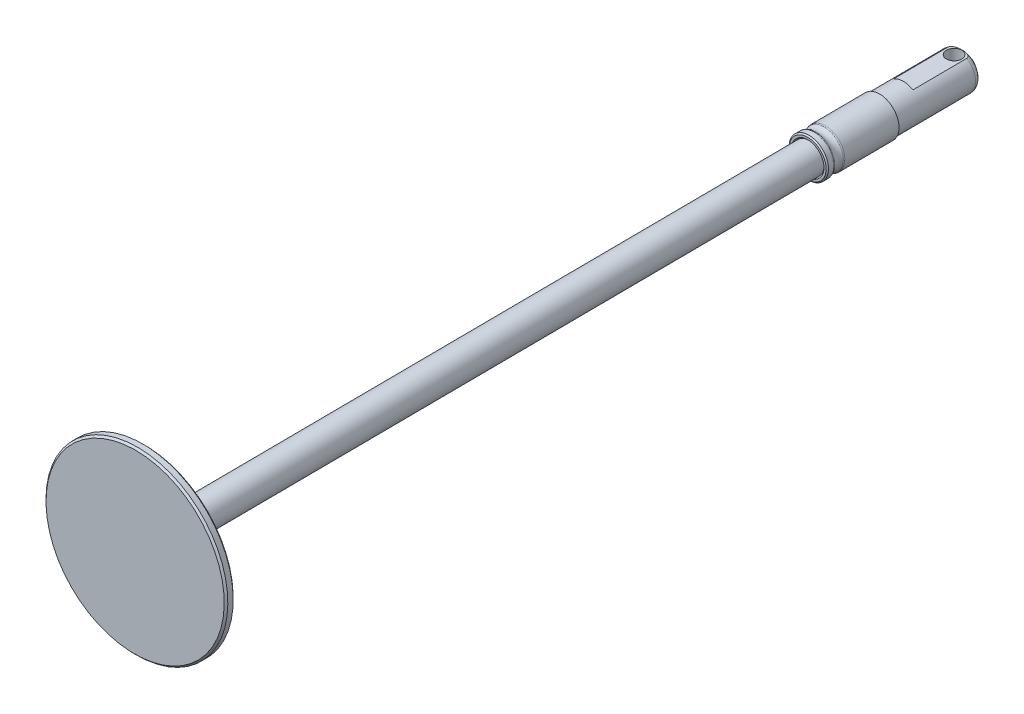
ISO-10303-21;
HEADER;
FILE_DESCRIPTION(('STEP AP214'),'2;1');
FILE_NAME('part.step','',(''),(''),'','','');
FILE_SCHEMA(('AUTOMOTIVE_DESIGN { 1 0 10303 214 1 1 1 1 }'));
ENDSEC;
DATA;
#1=APPLICATION_CONTEXT('core data for automotive mechanical design processes');
#2=APPLICATION_PROTOCOL_DEFINITION('international standard','automotive_design',2000,#1);
#3=PRODUCT_CONTEXT('',#1,'mechanical');
#4=PRODUCT('Part','Part','',(#3));
#5=PRODUCT_RELATED_PRODUCT_CATEGORY('part','',(#4));
#6=PRODUCT_DEFINITION_FORMATION('','',#4);
#7=PRODUCT_DEFINITION_CONTEXT('part definition',#1,'design');
#8=PRODUCT_DEFINITION('design','',#6,#7);
#9=PRODUCT_DEFINITION_SHAPE('','',#8);
#10=(LENGTH_UNIT() NAMED_UNIT(*) SI_UNIT(.MILLI.,.METRE.));
#11=(NAMED_UNIT(*) PLANE_ANGLE_UNIT() SI_UNIT($,.RADIAN.));
#12=(NAMED_UNIT(*) SI_UNIT($,.STERADIAN.) SOLID_ANGLE_UNIT());
#13=UNCERTAINTY_MEASURE_WITH_UNIT(LENGTH_MEASURE(1.E-05),#10,'distance_accuracy_value','');
#14=(GEOMETRIC_REPRESENTATION_CONTEXT(3) GLOBAL_UNCERTAINTY_ASSIGNED_CONTEXT((#13)) GLOBAL_UNIT_ASSIGNED_CONTEXT((#10,
#11,#12)) REPRESENTATION_CONTEXT('',''));
#15=CARTESIAN_POINT('',(0.,0.,0.));
#16=DIRECTION('',(0.,0.,1.));
#17=DIRECTION('',(1.,0.,0.));
#18=AXIS2_PLACEMENT_3D('',#15,#16,#17);
#19=CARTESIAN_POINT('',(6.47143842973408,0.,32.4994135550755));
#20=DIRECTION('',(0.00691899399214713,0.,0.99997606347459));
#21=DIRECTION('',(0.,-1.,0.));
#22=AXIS2_PLACEMENT_3D('',#19,#20,#21);
#23=CONICAL_SURFACE('',#22,2.70000000000437,0.785398163397448);
#24=CARTESIAN_POINT('',(6.47005463093599,0.,32.2994183424308));
#25=DIRECTION('',(0.00691899399214713,0.,0.99997606347459));
#26=DIRECTION('',(0.99997606347459,0.,-0.00691899399214713));
#27=AXIS2_PLACEMENT_3D('',#24,#25,#26);
#28=CIRCLE('',#27,2.50000000005457);
#29=CARTESIAN_POINT('',(8.96999478967704,0.,32.2821208574501));
#30=VERTEX_POINT('',#29);
#31=EDGE_CURVE('E282',#30,#30,#28,.T.);
#32=ORIENTED_EDGE('',*,*,#31,.F.);
#33=EDGE_LOOP('',(#32));
#34=FACE_BOUND('',#33,.T.);
#35=CARTESIAN_POINT('',(6.47143842973408,0.,32.4994135550755));
#36=DIRECTION('',(0.00691899399214713,0.,0.99997606347459));
#37=DIRECTION('',(0.,-1.,0.));
#38=AXIS2_PLACEMENT_3D('',#35,#36,#37);
#39=CIRCLE('',#38,2.70000000000437);
#40=CARTESIAN_POINT('',(6.47143842973408,-2.70000000000435,32.4994135550755));
#41=VERTEX_POINT('',#40);
#42=EDGE_CURVE('E285',#41,#41,#39,.F.);
#43=ORIENTED_EDGE('',*,*,#42,.F.);
#44=EDGE_LOOP('',(#43));
#45=FACE_BOUND('',#44,.T.);
#46=ADVANCED_FACE('F38',(#34,#45),#23,.F.);
#47=CARTESIAN_POINT('',(6.47143842973443,0.,32.4994135551274));
#48=DIRECTION('',(0.00691899399214713,0.,0.99997606347459));
#49=DIRECTION('',(0.99997606347459,0.,-0.00691899399214713));
#50=AXIS2_PLACEMENT_3D('',#47,#48,#49);
#51=PLANE('',#50);
#52=CARTESIAN_POINT('',(6.47143842973447,0.,32.4994135551324));
#53=DIRECTION('',(-0.00691899399214713,0.,-0.99997606347459));
#54=DIRECTION('',(0.,1.,0.));
#55=AXIS2_PLACEMENT_3D('',#52,#53,#54);
#56=CIRCLE('',#55,3.04999999997335);
#57=CARTESIAN_POINT('',(6.47143842973447,3.04999999997336,32.4994135551324));
#58=VERTEX_POINT('',#57);
#59=EDGE_CURVE('E291',#58,#58,#56,.T.);
#60=ORIENTED_EDGE('',*,*,#59,.F.);
#61=EDGE_LOOP('',(#60));
#62=FACE_BOUND('',#61,.T.);
#63=ORIENTED_EDGE('',*,*,#42,.T.);
#64=EDGE_LOOP('',(#63));
#65=FACE_BOUND('',#64,.T.);
#66=ADVANCED_FACE('F394',(#62,#65),#51,.T.);
#67=CARTESIAN_POINT('',(6.4700546309356,0.,32.299418342374));
#68=DIRECTION('',(-0.00691899399214713,0.,-0.99997606347459));
#69=DIRECTION('',(0.,1.,0.));
#70=AXIS2_PLACEMENT_3D('',#67,#68,#69);
#71=CONICAL_SURFACE('',#70,3.24999999997999,0.78539816325534);
#72=ORIENTED_EDGE('',*,*,#59,.T.);
#73=EDGE_LOOP('',(#72));
#74=FACE_BOUND('',#73,.T.);
#75=CARTESIAN_POINT('',(6.470054630936,0.,32.2994183424324));
#76=DIRECTION('',(-0.00691899399214713,0.,-0.99997606347459));
#77=DIRECTION('',(-0.99997606347459,0.,0.00691899399214713));
#78=AXIS2_PLACEMENT_3D('',#75,#76,#77);
#79=CIRCLE('',#78,3.25);
#80=CARTESIAN_POINT('',(3.22013242464359,0.,32.3219050729069));
#81=VERTEX_POINT('',#80);
#82=EDGE_CURVE('E287',#81,#81,#79,.T.);
#83=ORIENTED_EDGE('',*,*,#82,.F.);
#84=EDGE_LOOP('',(#83));
#85=FACE_BOUND('',#84,.T.);
#86=ADVANCED_FACE('F401',(#74,#85),#71,.T.);
#87=CARTESIAN_POINT('',(6.47143842973443,0.,32.4994135551274));
#88=DIRECTION('',(-0.00691899399214713,0.,-0.99997606347459));
#89=DIRECTION('',(-0.99997606347459,0.,0.00691899399214713));
#90=AXIS2_PLACEMENT_3D('',#87,#88,#89);
#91=CYLINDRICAL_SURFACE('',#90,3.25);
#92=ORIENTED_EDGE('',*,*,#82,.T.);
#93=EDGE_LOOP('',(#92));
#94=FACE_BOUND('',#93,.T.);
#95=CARTESIAN_POINT('',(6.46400751984752,0.,31.4254522215181));
#96=DIRECTION('',(-0.00691899399214887,0.,-0.99997606347459));
#97=DIRECTION('',(-0.99997606347459,0.,0.00691899399214899));
#98=AXIS2_PLACEMENT_3D('',#95,#96,#97);
#99=CIRCLE('',#98,3.25000000000171);
#100=CARTESIAN_POINT('',(3.21408531355339,0.,31.4479389519926));
#101=VERTEX_POINT('',#100);
#102=EDGE_CURVE('E290',#101,#101,#99,.T.);
#103=ORIENTED_EDGE('',*,*,#102,.F.);
#104=EDGE_LOOP('',(#103));
#105=FACE_BOUND('',#104,.T.);
#106=ADVANCED_FACE('F408',(#94,#105),#91,.T.);
#107=CARTESIAN_POINT('',(6.46400751984752,0.,31.4254522215181));
#108=DIRECTION('',(-0.00691899399214887,0.,-0.99997606347459));
#109=DIRECTION('',(-0.99997606347459,0.,0.00691899399214887));
#110=AXIS2_PLACEMENT_3D('',#107,#108,#109);
#111=TOROIDAL_SURFACE('',#110,2.95000000000171,0.3);
#112=ORIENTED_EDGE('',*,*,#102,.T.);
#113=EDGE_LOOP('',(#112));
#114=FACE_BOUND('',#113,.T.);
#115=CARTESIAN_POINT('',(6.46263457453887,0.,31.2270256229448));
#116=DIRECTION('',(0.00691899399215062,0.,0.99997606347459));
#117=DIRECTION('',(0.99997606347459,0.,-0.00691899399215068));
#118=AXIS2_PLACEMENT_3D('',#115,#116,#117);
#119=CIRCLE('',#118,3.17500000000299);
#120=CARTESIAN_POINT('',(9.63755857607368,0.,31.2050578170197));
#121=VERTEX_POINT('',#120);
#122=EDGE_CURVE('E118',#121,#121,#119,.T.);
#123=ORIENTED_EDGE('',*,*,#122,.T.);
#124=EDGE_LOOP('',(#123));
#125=FACE_BOUND('',#124,.T.);
#126=ADVANCED_FACE('F140',(#114,#125),#111,.T.);
#127=CARTESIAN_POINT('',(6.28462559194646,0.,5.50005984131344));
#128=DIRECTION('',(-0.00691899399214713,0.,-0.99997606347459));
#129=DIRECTION('',(-0.99997606347459,0.,0.00691899399214713));
#130=AXIS2_PLACEMENT_3D('',#127,#128,#129);
#131=PLANE('',#130);
#132=CARTESIAN_POINT('',(6.28462559194637,0.,5.50005984131344));
#133=DIRECTION('',(0.00691899399214713,0.,0.99997606347459));
#134=DIRECTION('',(0.99997606347459,0.,-0.00691899399214747));
#135=AXIS2_PLACEMENT_3D('',#132,#133,#134);
#136=CIRCLE('',#135,0.716666666666764);
#137=CARTESIAN_POINT('',(7.00127510410326,0.,5.4951012289524));
#138=VERTEX_POINT('',#137);
#139=CARTESIAN_POINT('',(5.56797607978949,0.,5.50501845367448));
#140=VERTEX_POINT('',#139);
#141=EDGE_CURVE('E114',#138,#140,#136,.T.);
#142=ORIENTED_EDGE('',*,*,#141,.F.);
#143=CARTESIAN_POINT('',(6.28462559194637,0.,5.50005984131344));
#144=DIRECTION('',(0.00691899399214713,0.,0.99997606347459));
#145=DIRECTION('',(-0.99997606347459,0.,0.00691899399214747));
#146=AXIS2_PLACEMENT_3D('',#143,#144,#145);
#147=CIRCLE('',#146,0.716666666666764);
#148=EDGE_CURVE('E110',#140,#138,#147,.T.);
#149=ORIENTED_EDGE('',*,*,#148,.F.);
#150=EDGE_LOOP('',(#142,#149));
#151=FACE_BOUND('',#150,.T.);
#152=ADVANCED_FACE('F121',(#151),#131,.T.);
#153=CARTESIAN_POINT('',(6.45760044174673,0.,30.4994614281782));
#154=DIRECTION('',(0.00691899399215062,0.,0.99997606347459));
#155=DIRECTION('',(0.99997606347459,0.,-0.00691899399215062));
#156=AXIS2_PLACEMENT_3D('',#153,#154,#155);
#157=TOROIDAL_SURFACE('',#156,4.00000000000341,1.1);
#158=ORIENTED_EDGE('',*,*,#122,.F.);
#159=EDGE_LOOP('',(#158));
#160=FACE_BOUND('',#159,.T.);
#161=CARTESIAN_POINT('',(6.45256630895634,0.,29.7718972334184));
#162=DIRECTION('',(0.00691899399214887,0.,0.99997606347459));
#163=DIRECTION('',(0.99997606347459,0.,-0.00691899399214876));
#164=AXIS2_PLACEMENT_3D('',#161,#162,#163);
#165=CIRCLE('',#164,3.17499999999869);
#166=CARTESIAN_POINT('',(9.62749031048685,0.,29.7499294274934));
#167=VERTEX_POINT('',#166);
#168=EDGE_CURVE('E122',#167,#167,#165,.F.);
#169=ORIENTED_EDGE('',*,*,#168,.F.);
#170=EDGE_LOOP('',(#169));
#171=FACE_BOUND('',#170,.T.);
#172=ADVANCED_FACE('F139',(#160,#171),#157,.F.);
#173=CARTESIAN_POINT('',(5.57489507378163,0.,6.50499451714907));
#174=DIRECTION('',(0.,1.,0.));
#175=DIRECTION('',(-0.99997606347459,0.,0.00691899399214713));
#176=AXIS2_PLACEMENT_3D('',#173,#174,#175);
#177=CIRCLE('',#176,1.);
#178=TRIMMED_CURVE('',#177,(PARAMETER_VALUE(-2.36980728294869)),
(PARAMETER_VALUE(2.36980728294869)),.T.,.PARAMETER.);
#179=CARTESIAN_POINT('',(6.29154458593852,0.,6.50003590478803));
#180=DIRECTION('',(-0.00691899399214713,0.,-0.99997606347459));
#181=AXIS1_PLACEMENT('',#179,#180);
#182=SURFACE_OF_REVOLUTION('',#178,#181);
#183=ORIENTED_EDGE('',*,*,#148,.T.);
#184=ORIENTED_EDGE('',*,*,#141,.T.);
#185=EDGE_LOOP('',(#183,#184));
#186=FACE_BOUND('',#185,.T.);
#187=CARTESIAN_POINT('',(6.28600939074497,0.,5.70005505403319));
#188=DIRECTION('',(0.00691899399215062,0.,0.99997606347459));
#189=DIRECTION('',(0.99997606347459,0.,-0.00691899399214976));
#190=AXIS2_PLACEMENT_3D('',#187,#188,#189);
#191=CIRCLE('',#190,1.31666666663942);
#192=CARTESIAN_POINT('',(7.60264454095926,0.,5.69094504527704));
#193=VERTEX_POINT('',#192);
#194=EDGE_CURVE('E170',#193,#193,#191,.T.);
#195=ORIENTED_EDGE('',*,*,#194,.F.);
#196=EDGE_LOOP('',(#195));
#197=FACE_BOUND('',#196,.T.);
#198=ADVANCED_FACE('F112',(#186,#197),#182,.F.);
#199=CARTESIAN_POINT('',(6.45119336364939,0.,29.573470634846));
#200=DIRECTION('',(0.00691899399214887,0.,0.99997606347459));
#201=DIRECTION('',(0.99997606347459,0.,-0.00691899399214887));
#202=AXIS2_PLACEMENT_3D('',#199,#200,#201);
#203=TOROIDAL_SURFACE('',#202,2.9499999999983,0.3);
#204=CARTESIAN_POINT('',(6.4511933636511,0.,29.573470634846));
#205=DIRECTION('',(-0.00691899399214713,0.,-0.99997606347459));
#206=DIRECTION('',(-0.99997606347459,0.,0.00691899399214713));
#207=AXIS2_PLACEMENT_3D('',#204,#205,#206);
#208=CIRCLE('',#207,3.25);
#209=CARTESIAN_POINT('',(3.20127115735869,0.,29.5959573653205));
#210=VERTEX_POINT('',#209);
#211=EDGE_CURVE('E176',#210,#210,#208,.T.);
#212=ORIENTED_EDGE('',*,*,#211,.F.);
#213=EDGE_LOOP('',(#212));
#214=FACE_BOUND('',#213,.T.);
#215=ORIENTED_EDGE('',*,*,#168,.T.);
#216=EDGE_LOOP('',(#215));
#217=FACE_BOUND('',#216,.T.);
#218=ADVANCED_FACE('F164',(#214,#217),#203,.T.);
#219=CARTESIAN_POINT('',(6.30192307692334,-3.24999999999998,7.99999999999993));
#220=DIRECTION('',(0.,1.,0.));
#221=DIRECTION('',(-0.99997606347459,0.,0.00691899399214713));
#222=AXIS2_PLACEMENT_3D('',#219,#220,#221);
#223=CYLINDRICAL_SURFACE('',#222,1.275);
#224=CARTESIAN_POINT('',(6.30192307692334,2.60000000000002,7.99999999999993));
#225=DIRECTION('',(0.,1.,0.));
#226=DIRECTION('',(-0.99997606347459,0.,0.00691899399214713));
#227=AXIS2_PLACEMENT_3D('',#224,#225,#226);
#228=CIRCLE('',#227,1.275);
#229=CARTESIAN_POINT('',(5.02695359599324,2.60000000000002,8.00882171733992));
#230=VERTEX_POINT('',#229);
#231=EDGE_CURVE('E173',#230,#230,#228,.T.);
#232=ORIENTED_EDGE('',*,*,#231,.T.);
#233=EDGE_LOOP('',(#232));
#234=FACE_BOUND('',#233,.T.);
#235=CARTESIAN_POINT('',(6.30192307692334,-2.59999999999998,7.99999999999993));
#236=DIRECTION('',(0.,1.,0.));
#237=DIRECTION('',(-0.99997606347459,0.,0.00691899399214713));
#238=AXIS2_PLACEMENT_3D('',#235,#236,#237);
#239=CIRCLE('',#238,1.275);
#240=CARTESIAN_POINT('',(5.02695359599324,-2.59999999999998,8.00882171733992));
#241=VERTEX_POINT('',#240);
#242=EDGE_CURVE('E195',#241,#241,#239,.F.);
#243=ORIENTED_EDGE('',*,*,#242,.T.);
#244=EDGE_LOOP('',(#243));
#245=FACE_BOUND('',#244,.T.);
#246=ADVANCED_FACE('F306',(#234,#245),#223,.F.);
#247=CARTESIAN_POINT('',(6.29292838473695,0.,6.70003111748414));
#248=DIRECTION('',(0.00691899399215105,0.,0.99997606347459));
#249=DIRECTION('',(0.99997606347459,0.,-0.00691899399215105));
#250=AXIS2_PLACEMENT_3D('',#247,#248,#249);
#251=CONICAL_SURFACE('',#250,2.64999999996017,0.92729521800843);
#252=CARTESIAN_POINT('',(6.29292838473695,0.,6.70003111748294));
#253=DIRECTION('',(-0.00691899399215062,0.,-0.99997606347459));
#254=DIRECTION('',(-0.99997606347459,0.,0.00691899399215105));
#255=AXIS2_PLACEMENT_3D('',#252,#253,#254);
#256=CIRCLE('',#255,2.65000000000009);
#257=CARTESIAN_POINT('',(5.78059311022955,2.60000000000002,6.7035760470267));
#258=VERTEX_POINT('',#257);
#259=CARTESIAN_POINT('',(5.78059311026074,-2.59999999999998,6.70357604703755));
#260=VERTEX_POINT('',#259);
#261=EDGE_CURVE('E179',#258,#260,#256,.F.);
#262=ORIENTED_EDGE('',*,*,#261,.F.);
#263=CARTESIAN_POINT('',(5.78059311023422,2.60000000000002,6.70357604705716));
#264=CARTESIAN_POINT('',(5.86552023323553,2.60000000000002,6.69061135992893));
#265=CARTESIAN_POINT('',(5.95092196332494,2.60000000000002,6.68062820190784));
#266=CARTESIAN_POINT('',(6.12176650438817,2.60000000000002,6.66690060894354));
#267=CARTESIAN_POINT('',(6.20720669140374,2.60000000000002,6.66312334195217));
#268=CARTESIAN_POINT('',(6.37813115349206,2.60000000000002,6.66194068831653));
#269=CARTESIAN_POINT('',(6.46361542856481,2.60000000000002,6.66453530167226));
#270=CARTESIAN_POINT('',(6.63463356984458,2.60000000000002,6.67589749217037));
#271=CARTESIAN_POINT('',(6.72016526666318,2.60000000000002,6.68469793452684));
#272=CARTESIAN_POINT('',(6.80526365921131,2.60000000000002,6.69648618797409));
#273=B_SPLINE_CURVE_WITH_KNOTS('',3,(#263,#264,#265,#266,#267,#268,#269,#270,#271,#272),
.UNSPECIFIED.,.F.,.F.,(4,2,2,2,4),(0.,0.257710646406221,0.514053441173921,0.770396235941627,
1.02810688234785),.UNSPECIFIED.);
#274=CARTESIAN_POINT('',(6.80526365921342,2.60000000000002,6.69648618795882));
#275=VERTEX_POINT('',#274);
#276=EDGE_CURVE('E180',#258,#275,#273,.T.);
#277=ORIENTED_EDGE('',*,*,#276,.T.);
#278=CARTESIAN_POINT('',(6.29292838473695,0.,6.70003111748294));
#279=DIRECTION('',(-0.00691899399215062,0.,-0.99997606347459));
#280=DIRECTION('',(-0.99997606347459,0.,0.00691899399215105));
#281=AXIS2_PLACEMENT_3D('',#278,#279,#280);
#282=CIRCLE('',#281,2.65000000000009);
#283=CARTESIAN_POINT('',(6.80526365921337,-2.59999999999998,6.69648618795881));
#284=VERTEX_POINT('',#283);
#285=EDGE_CURVE('E243',#284,#275,#282,.F.);
#286=ORIENTED_EDGE('',*,*,#285,.F.);
#287=CARTESIAN_POINT('',(6.80526365921122,-2.59999999999998,6.69648618797408));
#288=CARTESIAN_POINT('',(6.72016526666553,-2.59999999999998,6.68469793452717));
#289=CARTESIAN_POINT('',(6.63463356984939,-2.59999999999998,6.67589749217087));
#290=CARTESIAN_POINT('',(6.46361542857452,-2.59999999999998,6.66453530167273));
#291=CARTESIAN_POINT('',(6.3781311535042,-2.59999999999998,6.6619406883168));
#292=CARTESIAN_POINT('',(6.20720669142073,-2.59999999999998,6.66312334195169));
#293=CARTESIAN_POINT('',(6.12176650440756,-2.59999999999998,6.6669006089425));
#294=CARTESIAN_POINT('',(5.95092196334911,-2.59999999999998,6.68062820190536));
#295=CARTESIAN_POINT('',(5.86552023326208,-2.59999999999998,6.69061135992556));
#296=CARTESIAN_POINT('',(5.7805931102631,-2.59999999999998,6.70357604705277));
#297=B_SPLINE_CURVE_WITH_KNOTS('',3,(#287,#288,#289,#290,#291,#292,#293,#294,#295,#296),
.UNSPECIFIED.,.F.,.F.,(4,2,2,2,4),(0.,0.257710646398846,0.514053441159284,0.770396235919723,
1.02810688231857),.UNSPECIFIED.);
#298=EDGE_CURVE('E273',#284,#260,#297,.T.);
#299=ORIENTED_EDGE('',*,*,#298,.T.);
#300=EDGE_LOOP('',(#262,#277,#286,#299));
#301=FACE_BOUND('',#300,.T.);
#302=ORIENTED_EDGE('',*,*,#194,.T.);
#303=EDGE_LOOP('',(#302));
#304=FACE_BOUND('',#303,.T.);
#305=ADVANCED_FACE('F311',(#301,#304),#251,.T.);
#306=CARTESIAN_POINT('',(-10.1388705214707,3.25000000000002,16.6139599404043));
#307=DIRECTION('',(0.00691899399214713,0.,0.99997606347459));
#308=DIRECTION('',(0.99997606347459,0.,-0.00691899399214713));
#309=AXIS2_PLACEMENT_3D('',#306,#307,#308);
#310=PLANE('',#309);
#311=CARTESIAN_POINT('',(6.36073452586002,0.,16.499796539534));
#312=DIRECTION('',(0.00691899399215062,0.,0.99997606347459));
#313=DIRECTION('',(0.99997606347459,0.,-0.00691899399215062));
#314=AXIS2_PLACEMENT_3D('',#311,#312,#313);
#315=CIRCLE('',#314,3.05000000000008);
#316=CARTESIAN_POINT('',(7.95521823045706,2.60000000000002,16.4887640522819));
#317=VERTEX_POINT('',#316);
#318=CARTESIAN_POINT('',(4.76625082126298,2.60000000000002,16.5108290267861));
#319=VERTEX_POINT('',#318);
#320=EDGE_CURVE('E183',#317,#319,#315,.T.);
#321=ORIENTED_EDGE('',*,*,#320,.F.);
#322=DIRECTION('',(0.99997606347459,0.,-0.00691899399214713));
#323=VECTOR('',#322,1.);
#324=CARTESIAN_POINT('',(-10.1388705214707,2.60000000000002,16.6139599404045));
#325=LINE('',#324,#323);
#326=EDGE_CURVE('E98',#317,#319,#325,.F.);
#327=ORIENTED_EDGE('',*,*,#326,.T.);
#328=EDGE_LOOP('',(#321,#327));
#329=FACE_BOUND('',#328,.T.);
#330=ADVANCED_FACE('F234',(#329),#310,.F.);
#331=CARTESIAN_POINT('',(-10.1388705214707,2.60000000000002,16.6139599404043));
#332=DIRECTION('',(0.,-1.,0.));
#333=DIRECTION('',(-0.00691899399214713,0.,-0.99997606347459));
#334=AXIS2_PLACEMENT_3D('',#331,#332,#333);
#335=PLANE('',#334);
#336=CARTESIAN_POINT('',(4.70397987533363,2.60000000000002,7.5110444555147));
#337=CARTESIAN_POINT('',(4.70384987644721,2.60000000000002,7.49290841887377));
#338=CARTESIAN_POINT('',(4.70467367993067,2.60000000000002,7.4747792306576));
#339=CARTESIAN_POINT('',(4.70817762205473,2.60000000000002,7.43872032171689));
#340=CARTESIAN_POINT('',(4.71085575720852,2.60000000000002,7.42079040691319));
#341=CARTESIAN_POINT('',(4.72151035677255,2.60000000000002,7.36795172331959));
#342=CARTESIAN_POINT('',(4.73210683583856,2.60000000000002,7.33354430287102));
#343=CARTESIAN_POINT('',(4.75931961074297,2.60000000000002,7.26743057494155));
#344=CARTESIAN_POINT('',(4.77591271055891,2.60000000000002,7.23571443303589));
#345=CARTESIAN_POINT('',(4.81399534252052,2.60000000000002,7.17529865328853));
#346=CARTESIAN_POINT('',(4.83549871942386,2.60000000000002,7.14660788654726));
#347=CARTESIAN_POINT('',(4.89191934875167,2.60000000000002,7.08134381848383));
#348=CARTESIAN_POINT('',(4.92871113766357,2.60000000000002,7.04639998413353));
#349=CARTESIAN_POINT('',(5.00728682887246,2.60000000000002,6.98272702596022));
#350=CARTESIAN_POINT('',(5.04908010401538,2.60000000000001,6.95400986324759));
#351=CARTESIAN_POINT('',(5.16383022771077,2.60000000000001,6.88534773186314));
#352=CARTESIAN_POINT('',(5.23954402733486,2.60000000000002,6.850058458898));
#353=CARTESIAN_POINT('',(5.3952448432293,2.60000000000002,6.79081299539318));
#354=CARTESIAN_POINT('',(5.47524336906396,2.60000000000002,6.76688922834342));
#355=CARTESIAN_POINT('',(5.59338878295469,2.60000000000002,6.73829565222909));
#356=CARTESIAN_POINT('',(5.63075729257948,2.60000000000002,6.73021238396721));
#357=CARTESIAN_POINT('',(5.70558026739417,2.60000000000002,6.71571581567108));
#358=CARTESIAN_POINT('',(5.74303279523037,2.60000000000002,6.70929256443689));
#359=CARTESIAN_POINT('',(5.78059311022959,2.60000000000002,6.7035760470267));
#360=B_SPLINE_CURVE_WITH_KNOTS('',3,(#336,#337,#338,#339,#340,#341,#342,#343,#344,#345,#346,
#347,#348,#349,#350,#351,#352,#353,#354,#355,#356,#357,#358,#359),.UNSPECIFIED.,.F.,.F.,(4,2,2,
2,2,2,2,2,2,2,2,4),(0.,0.0543595006208801,0.108660360737125,0.215938070539347,0.322805175998552,
0.429977402492625,0.581352056766434,0.733014967075773,0.982209476205452,1.23211068022507,
1.34678143385737,1.46074793888463),.UNSPECIFIED.);
#361=CARTESIAN_POINT('',(4.70397987533363,2.60000000000002,7.5110444555147));
#362=VERTEX_POINT('',#361);
#363=EDGE_CURVE('E186',#362,#258,#360,.T.);
#364=ORIENTED_EDGE('',*,*,#363,.F.);
#365=DIRECTION('',(0.00691899399215062,0.,0.99997606347459));
#366=VECTOR('',#365,1.);
#367=CARTESIAN_POINT('',(11.8028677112802,2.59999999999979,1033.48648558044));
#368=LINE('',#367,#366);
#369=EDGE_CURVE('E187',#319,#362,#368,.F.);
#370=ORIENTED_EDGE('',*,*,#369,.F.);
#371=ORIENTED_EDGE('',*,*,#326,.F.);
#372=DIRECTION('',(0.00691899399215062,0.,0.99997606347459));
#373=VECTOR('',#372,1.);
#374=CARTESIAN_POINT('',(14.9918351204742,2.59999999999979,1033.46442060594));
#375=LINE('',#374,#373);
#376=CARTESIAN_POINT('',(7.8929472845277,2.60000000000002,7.48897948101051));
#377=VERTEX_POINT('',#376);
#378=EDGE_CURVE('E181',#377,#317,#375,.T.);
#379=ORIENTED_EDGE('',*,*,#378,.F.);
#380=CARTESIAN_POINT('',(6.80526365921553,2.60000000000002,6.69648618794356));
#381=CARTESIAN_POINT('',(6.8561154976496,2.60000000000002,6.70352634348705));
#382=CARTESIAN_POINT('',(6.9068293715514,2.60000000000002,6.71183531196478));
#383=CARTESIAN_POINT('',(7.00787456033053,2.60000000000002,6.73156842313693));
#384=CARTESIAN_POINT('',(7.05820318585411,2.60000000000002,6.74300620065973));
#385=CARTESIAN_POINT('',(7.15863558469799,2.60000000000002,6.76971330964486));
#386=CARTESIAN_POINT('',(7.20872559122189,2.60000000000002,6.78503563745771));
#387=CARTESIAN_POINT('',(7.30724687635603,2.60000000000002,6.82012973000199));
#388=CARTESIAN_POINT('',(7.35568118605749,2.60000000000002,6.83989279999233));
#389=CARTESIAN_POINT('',(7.4458536808667,2.60000000000002,6.8827245761694));
#390=CARTESIAN_POINT('',(7.48780361177337,2.60000000000003,6.9053405613773));
#391=CARTESIAN_POINT('',(7.56852650767192,2.60000000000001,6.95562734933633));
#392=CARTESIAN_POINT('',(7.60730455729318,2.59999999999997,6.98328982290031));
#393=CARTESIAN_POINT('',(7.6807406333427,2.60000000000003,7.04473791282664));
#394=CARTESIAN_POINT('',(7.71532996694611,2.60000000000013,7.07860730821165));
#395=CARTESIAN_POINT('',(7.7773368040371,2.59999999999991,7.15241010268089));
#396=CARTESIAN_POINT('',(7.80477485927188,2.5999999999996,7.19232559149439));
#397=CARTESIAN_POINT('',(7.84177699491922,2.59999999999973,7.2624224590737));
#398=CARTESIAN_POINT('',(7.85423315948979,2.59999999999994,7.2910862113278));
#399=CARTESIAN_POINT('',(7.87421840865154,2.60000000000009,7.3500668753495));
#400=CARTESIAN_POINT('',(7.88175801621602,2.60000000000003,7.38038010494399));
#401=CARTESIAN_POINT('',(7.88860703832785,2.60000000000001,7.42397173510465));
#402=CARTESIAN_POINT('',(7.89015347167473,2.60000000000002,7.43692704495919));
#403=CARTESIAN_POINT('',(7.89227839762122,2.60000000000002,7.46291142619274));
#404=CARTESIAN_POINT('',(7.89285728328814,2.60000000000003,7.47594046545958));
#405=CARTESIAN_POINT('',(7.8929472845277,2.60000000000002,7.48897948101051));
#406=B_SPLINE_CURVE_WITH_KNOTS('',3,(#380,#381,#382,#383,#384,#385,#386,#387,#388,#389,#390,
#391,#392,#393,#394,#395,#396,#397,#398,#399,#400,#401,#402,#403,#404,#405),.UNSPECIFIED.,.F.,
.F.,(4,2,2,2,2,2,2,2,2,2,2,2,4),(0.,0.154050765632774,0.308783858109109,0.465753667288842,
0.622418775181398,0.765095356129827,0.907538546731808,1.05206885101856,1.1961790981966,
1.28957553046733,1.38277140321643,1.42188324686408,1.46097919741619),.UNSPECIFIED.);
#407=EDGE_CURVE('E184',#275,#377,#406,.T.);
#408=ORIENTED_EDGE('',*,*,#407,.F.);
#409=ORIENTED_EDGE('',*,*,#276,.F.);
#410=EDGE_LOOP('',(#364,#370,#371,#379,#408,#409));
#411=FACE_BOUND('',#410,.T.);
#412=ORIENTED_EDGE('',*,*,#231,.F.);
#413=EDGE_LOOP('',(#412));
#414=FACE_BOUND('',#413,.T.);
#415=ADVANCED_FACE('F230',(#411,#414),#335,.F.);
#416=CARTESIAN_POINT('',(6.47143842973443,0.,32.4994135551274));
#417=DIRECTION('',(-0.00691899399214713,0.,-0.99997606347459));
#418=DIRECTION('',(-0.99997606347459,0.,0.00691899399214713));
#419=AXIS2_PLACEMENT_3D('',#416,#417,#418);
#420=CYLINDRICAL_SURFACE('',#419,3.25);
#421=ORIENTED_EDGE('',*,*,#211,.T.);
#422=EDGE_LOOP('',(#421));
#423=FACE_BOUND('',#422,.T.);
#424=CARTESIAN_POINT('',(6.38841050182867,0.,20.4997007934323));
#425=DIRECTION('',(-0.00691899399214713,0.,-0.99997606347459));
#426=DIRECTION('',(-0.99997606347459,0.,0.00691899399214713));
#427=AXIS2_PLACEMENT_3D('',#424,#425,#426);
#428=CIRCLE('',#427,3.25);
#429=CARTESIAN_POINT('',(3.13848829553625,0.,20.5221875239068));
#430=VERTEX_POINT('',#429);
#431=EDGE_CURVE('E190',#430,#430,#428,.F.);
#432=ORIENTED_EDGE('',*,*,#431,.T.);
#433=EDGE_LOOP('',(#432));
#434=FACE_BOUND('',#433,.T.);
#435=ADVANCED_FACE('F207',(#423,#434),#420,.T.);
#436=CARTESIAN_POINT('',(6.29846357993067,0.,7.5000119682626));
#437=DIRECTION('',(-0.00691899399215062,0.,-0.99997606347459));
#438=DIRECTION('',(-0.99997606347459,0.,0.00691899399215062));
#439=AXIS2_PLACEMENT_3D('',#436,#437,#438);
#440=TOROIDAL_SURFACE('',#439,2.05000000000008,1.);
#441=ORIENTED_EDGE('',*,*,#261,.T.);
#442=CARTESIAN_POINT('',(5.78059311025847,-2.59999999999998,6.7035760470223));
#443=CARTESIAN_POINT('',(5.7298435598873,-2.59999999999998,6.71131919879181));
#444=CARTESIAN_POINT('',(5.67924951823685,-2.59999999999998,6.72032913290729));
#445=CARTESIAN_POINT('',(5.57848706404387,-2.59999999999998,6.74145858337225));
#446=CARTESIAN_POINT('',(5.52832152927166,-2.59999999999998,6.75359169603028));
#447=CARTESIAN_POINT('',(5.4282683101303,-2.59999999999998,6.78168599700631));
#448=CARTESIAN_POINT('',(5.37839512458475,-2.59999999999998,6.7976999861005));
#449=CARTESIAN_POINT('',(5.2803688923733,-2.59999999999998,6.83415402228879));
#450=CARTESIAN_POINT('',(5.23221269459154,-2.59999999999998,6.85458541741749));
#451=CARTESIAN_POINT('',(5.14264152476062,-2.59999999999998,6.89866086869959));
#452=CARTESIAN_POINT('',(5.10100856258862,-2.59999999999999,6.92185517728559));
#453=CARTESIAN_POINT('',(5.02098924681104,-2.59999999999997,6.97325416626373));
#454=CARTESIAN_POINT('',(4.98259769380648,-2.59999999999994,7.00145058862553));
#455=CARTESIAN_POINT('',(4.91001894646721,-2.6,7.06390897842072));
#456=CARTESIAN_POINT('',(4.87590159768571,-2.60000000000009,7.09825376630762));
#457=CARTESIAN_POINT('',(4.81492195517371,-2.59999999999987,7.17290752385945));
#458=CARTESIAN_POINT('',(4.78803886382756,-2.59999999999957,7.21319886935649));
#459=CARTESIAN_POINT('',(4.75201024734093,-2.59999999999969,7.28380104836646));
#460=CARTESIAN_POINT('',(4.73995191455017,-2.59999999999991,7.31263442034063));
#461=CARTESIAN_POINT('',(4.72078473305888,-2.60000000000006,7.37188598627924));
#462=CARTESIAN_POINT('',(4.71366531143994,-2.6,7.40230064403642));
#463=CARTESIAN_POINT('',(4.70742015110281,-2.59999999999998,7.44598287493545));
#464=CARTESIAN_POINT('',(4.70605313694998,-2.59999999999998,7.45895834339827));
#465=CARTESIAN_POINT('',(4.70428797740283,-2.59999999999999,7.48496964075426));
#466=CARTESIAN_POINT('',(4.70388943853446,-2.59999999999999,7.49800544297747));
#467=CARTESIAN_POINT('',(4.70397987533363,-2.59999999999998,7.5110444555147));
#468=B_SPLINE_CURVE_WITH_KNOTS('',3,(#442,#443,#444,#445,#446,#447,#448,#449,#450,#451,#452,
#453,#454,#455,#456,#457,#458,#459,#460,#461,#462,#463,#464,#465,#466,#467),.UNSPECIFIED.,.F.,
.F.,(4,2,2,2,2,2,2,2,2,2,2,2,4),(0.,0.154050765632784,0.308783858109128,0.465753667288872,
0.622418775181439,0.765095356129876,0.907538546731866,1.05206885101862,1.19617909819667,
1.28957553046741,1.38277140321651,1.42188324686416,1.46097919741628),.UNSPECIFIED.);
#469=CARTESIAN_POINT('',(4.70397987533363,-2.59999999999998,7.51104445551469));
#470=VERTEX_POINT('',#469);
#471=EDGE_CURVE('E212',#260,#470,#468,.T.);
#472=ORIENTED_EDGE('',*,*,#471,.T.);
#473=CARTESIAN_POINT('',(6.29846357993067,0.,7.5000119682626));
#474=DIRECTION('',(0.00691899399215062,0.,0.99997606347459));
#475=DIRECTION('',(0.99997606347459,0.,-0.00691899399215062));
#476=AXIS2_PLACEMENT_3D('',#473,#474,#475);
#477=CIRCLE('',#476,3.05000000000008);
#478=EDGE_CURVE('E84',#362,#470,#477,.T.);
#479=ORIENTED_EDGE('',*,*,#478,.F.);
#480=ORIENTED_EDGE('',*,*,#363,.T.);
#481=EDGE_LOOP('',(#441,#472,#479,#480));
#482=FACE_BOUND('',#481,.T.);
#483=ADVANCED_FACE('F201',(#482),#440,.T.);
#484=CARTESIAN_POINT('',(-10.1388705214707,-3.24999999999998,16.6139599404043));
#485=DIRECTION('',(0.00691899399214713,0.,0.99997606347459));
#486=DIRECTION('',(0.99997606347459,0.,-0.00691899399214713));
#487=AXIS2_PLACEMENT_3D('',#484,#485,#486);
#488=PLANE('',#487);
#489=CARTESIAN_POINT('',(6.36073452586002,0.,16.499796539534));
#490=DIRECTION('',(0.00691899399215062,0.,0.99997606347459));
#491=DIRECTION('',(0.99997606347459,0.,-0.00691899399215062));
#492=AXIS2_PLACEMENT_3D('',#489,#490,#491);
#493=CIRCLE('',#492,3.05000000000008);
#494=CARTESIAN_POINT('',(4.76625082126298,-2.59999999999998,16.5108290267861));
#495=VERTEX_POINT('',#494);
#496=CARTESIAN_POINT('',(7.95521823045705,-2.59999999999999,16.4887640522819));
#497=VERTEX_POINT('',#496);
#498=EDGE_CURVE('E270',#495,#497,#493,.T.);
#499=ORIENTED_EDGE('',*,*,#498,.F.);
#500=DIRECTION('',(0.99997606347459,0.,-0.00691899399214713));
#501=VECTOR('',#500,1.);
#502=CARTESIAN_POINT('',(-10.1388705214707,-2.59999999999998,16.6139599404045));
#503=LINE('',#502,#501);
#504=EDGE_CURVE('E271',#495,#497,#503,.T.);
#505=ORIENTED_EDGE('',*,*,#504,.T.);
#506=EDGE_LOOP('',(#499,#505));
#507=FACE_BOUND('',#506,.T.);
#508=ADVANCED_FACE('F206',(#507),#488,.F.);
#509=CARTESIAN_POINT('',(-10.1388705214707,-2.59999999999998,16.6139599404043));
#510=DIRECTION('',(0.,1.,0.));
#511=DIRECTION('',(0.00691899399214713,0.,0.99997606347459));
#512=AXIS2_PLACEMENT_3D('',#509,#510,#511);
#513=PLANE('',#512);
#514=ORIENTED_EDGE('',*,*,#471,.F.);
#515=ORIENTED_EDGE('',*,*,#298,.F.);
#516=CARTESIAN_POINT('',(7.8929472845277,-2.59999999999998,7.4889794810105));
#517=CARTESIAN_POINT('',(7.89282631071752,-2.59999999999998,7.47084338192363));
#518=CARTESIAN_POINT('',(7.89175172062538,-2.59999999999998,7.45272732899561));
#519=CARTESIAN_POINT('',(7.88774914318137,-2.59999999999998,7.41672035886193));
#520=CARTESIAN_POINT('',(7.88482315643889,-2.59999999999998,7.39882921987212));
#521=CARTESIAN_POINT('',(7.87343841343228,-2.59999999999998,7.34614303000753));
#522=CARTESIAN_POINT('',(7.86236683085184,-2.59999999999998,7.31188553433599));
#523=CARTESIAN_POINT('',(7.83424180235975,-2.59999999999998,7.24615469750085));
#524=CARTESIAN_POINT('',(7.81721141416426,-2.59999999999998,7.21467120187547));
#525=CARTESIAN_POINT('',(7.77829641560007,-2.59999999999998,7.15478818102353));
#526=CARTESIAN_POINT('',(7.75639808455452,-2.59999999999998,7.12639771762703));
#527=CARTESIAN_POINT('',(7.69907975544533,-2.59999999999998,7.06192062757122));
#528=CARTESIAN_POINT('',(7.66180794837633,-2.59999999999998,7.02748925106301));
#529=CARTESIAN_POINT('',(7.582358695854,-2.59999999999998,6.96490969269818));
#530=CARTESIAN_POINT('',(7.54017204396588,-2.59999999999998,6.93677360050495));
#531=CARTESIAN_POINT('',(7.42448278401013,-2.59999999999998,6.86970591599706));
#532=CARTESIAN_POINT('',(7.34828791275416,-2.59999999999998,6.8354677233723));
#533=CARTESIAN_POINT('',(7.19178218603943,-2.59999999999998,6.77838246676796));
#534=CARTESIAN_POINT('',(7.11146027078345,-2.59999999999998,6.75556798243929));
#535=CARTESIAN_POINT('',(6.99293050062379,-2.59999999999998,6.72861199969867));
#536=CARTESIAN_POINT('',(6.95545371534884,-2.59999999999998,6.72104659797758));
#537=CARTESIAN_POINT('',(6.88043730591075,-2.59999999999998,6.70758679229599));
#538=CARTESIAN_POINT('',(6.84289948121453,-2.59999999999998,6.70168241127991));
#539=CARTESIAN_POINT('',(6.80526365921543,-2.59999999999998,6.69648618794355));
#540=B_SPLINE_CURVE_WITH_KNOTS('',3,(#516,#517,#518,#519,#520,#521,#522,#523,#524,#525,#526,
#527,#528,#529,#530,#531,#532,#533,#534,#535,#536,#537,#538,#539),.UNSPECIFIED.,.F.,.F.,(4,2,2,
2,2,2,2,2,2,2,2,4),(0.,0.0543595006208795,0.108660360737124,0.215938070539345,0.322805175998548,
0.42997740249262,0.58135205676643,0.733014967075762,0.982209476205401,1.23211068022505,
1.34678143387205,1.46074793891383),.UNSPECIFIED.);
#541=CARTESIAN_POINT('',(7.8929472845277,-2.59999999999999,7.48897948101051));
#542=VERTEX_POINT('',#541);
#543=EDGE_CURVE('E58',#542,#284,#540,.T.);
#544=ORIENTED_EDGE('',*,*,#543,.F.);
#545=DIRECTION('',(0.00691899399215062,0.,0.99997606347459));
#546=VECTOR('',#545,1.);
#547=CARTESIAN_POINT('',(14.9918351204742,-2.60000000000022,1033.46442060594));
#548=LINE('',#547,#546);
#549=EDGE_CURVE('E268',#497,#542,#548,.F.);
#550=ORIENTED_EDGE('',*,*,#549,.F.);
#551=ORIENTED_EDGE('',*,*,#504,.F.);
#552=DIRECTION('',(0.00691899399215062,0.,0.99997606347459));
#553=VECTOR('',#552,1.);
#554=CARTESIAN_POINT('',(11.8028677112802,-2.60000000000021,1033.48648558044));
#555=LINE('',#554,#553);
#556=EDGE_CURVE('E274',#470,#495,#555,.T.);
#557=ORIENTED_EDGE('',*,*,#556,.F.);
#558=EDGE_LOOP('',(#514,#515,#544,#550,#551,#557));
#559=FACE_BOUND('',#558,.T.);
#560=ORIENTED_EDGE('',*,*,#242,.F.);
#561=EDGE_LOOP('',(#560));
#562=FACE_BOUND('',#561,.T.);
#563=ADVANCED_FACE('F254',(#559,#562),#513,.F.);
#564=CARTESIAN_POINT('',(6.29846357993067,0.,7.5000119682626));
#565=DIRECTION('',(-0.00691899399215062,0.,-0.99997606347459));
#566=DIRECTION('',(-0.99997606347459,0.,0.00691899399215062));
#567=AXIS2_PLACEMENT_3D('',#564,#565,#566);
#568=TOROIDAL_SURFACE('',#567,2.05000000000008,1.);
#569=ORIENTED_EDGE('',*,*,#407,.T.);
#570=CARTESIAN_POINT('',(6.29846357993067,0.,7.5000119682626));
#571=DIRECTION('',(0.00691899399215062,0.,0.99997606347459));
#572=DIRECTION('',(0.99997606347459,0.,-0.00691899399215062));
#573=AXIS2_PLACEMENT_3D('',#570,#571,#572);
#574=CIRCLE('',#573,3.05000000000008);
#575=EDGE_CURVE('E49',#542,#377,#574,.T.);
#576=ORIENTED_EDGE('',*,*,#575,.F.);
#577=ORIENTED_EDGE('',*,*,#543,.T.);
#578=ORIENTED_EDGE('',*,*,#285,.T.);
#579=EDGE_LOOP('',(#569,#576,#577,#578));
#580=FACE_BOUND('',#579,.T.);
#581=ADVANCED_FACE('F248',(#580),#568,.T.);
#582=CARTESIAN_POINT('',(10.169408866543,0.,20.4735394622511));
#583=DIRECTION('',(0.00691899399215062,0.,0.99997606347459));
#584=DIRECTION('',(0.99997606347459,0.,-0.00691899399215062));
#585=AXIS2_PLACEMENT_3D('',#582,#583,#584);
#586=PLANE('',#585);
#587=ORIENTED_EDGE('',*,*,#431,.F.);
#588=EDGE_LOOP('',(#587));
#589=FACE_BOUND('',#588,.T.);
#590=CARTESIAN_POINT('',(6.38841050182862,0.,20.4997007934324));
#591=DIRECTION('',(0.00691899399215062,0.,0.99997606347459));
#592=DIRECTION('',(0.99997606347459,0.,-0.00691899399215062));
#593=AXIS2_PLACEMENT_3D('',#590,#591,#592);
#594=CIRCLE('',#593,3.05000000000008);
#595=CARTESIAN_POINT('',(9.4383374954262,0.,20.4785978617563));
#596=VERTEX_POINT('',#595);
#597=EDGE_CURVE('E11',#596,#596,#594,.F.);
#598=ORIENTED_EDGE('',*,*,#597,.F.);
#599=EDGE_LOOP('',(#598));
#600=FACE_BOUND('',#599,.T.);
#601=ADVANCED_FACE('F253',(#589,#600),#586,.F.);
#602=CARTESIAN_POINT('',(13.3973514158772,-2.10823680776953E-13,1033.47545309319));
#603=DIRECTION('',(0.00691899399215062,0.,0.99997606347459));
#604=DIRECTION('',(0.99997606347459,0.,-0.00691899399215062));
#605=AXIS2_PLACEMENT_3D('',#602,#603,#604);
#606=CYLINDRICAL_SURFACE('',#605,3.05000000000008);
#607=ORIENTED_EDGE('',*,*,#369,.T.);
#608=ORIENTED_EDGE('',*,*,#478,.T.);
#609=ORIENTED_EDGE('',*,*,#556,.T.);
#610=ORIENTED_EDGE('',*,*,#498,.T.);
#611=ORIENTED_EDGE('',*,*,#549,.T.);
#612=ORIENTED_EDGE('',*,*,#575,.T.);
#613=ORIENTED_EDGE('',*,*,#378,.T.);
#614=ORIENTED_EDGE('',*,*,#320,.T.);
#615=EDGE_LOOP('',(#607,#608,#609,#610,#611,#612,#613,#614));
#616=FACE_BOUND('',#615,.T.);
#617=ORIENTED_EDGE('',*,*,#597,.T.);
#618=EDGE_LOOP('',(#617));
#619=FACE_BOUND('',#618,.T.);
#620=ADVANCED_FACE('F314',(#616,#619),#606,.T.);
#621=CARTESIAN_POINT('',(7.23944676286248,0.,143.496756600807));
#622=DIRECTION('',(-0.00691899399214687,0.,-0.99997606347459));
#623=DIRECTION('',(0.316284171878906,-0.948661970057751,-0.00218842066822821));
#624=AXIS2_PLACEMENT_3D('',#621,#622,#623);
#625=CYLINDRICAL_SURFACE('',#624,2.5);
#626=CARTESIAN_POINT('',(7.20692749109953,0.,138.796869102498));
#627=DIRECTION('',(-0.00691899399214702,0.,-0.99997606347459));
#628=DIRECTION('',(0.75678838743918,0.653638980924731,-0.00523633964579507));
#629=AXIS2_PLACEMENT_3D('',#626,#627,#628);
#630=CIRCLE('',#629,2.49999999994088);
#631=CARTESIAN_POINT('',(9.09889845965274,1.63409745227316,138.783778253384));
#632=VERTEX_POINT('',#631);
#633=EDGE_CURVE('E371',#632,#632,#630,.T.);
#634=ORIENTED_EDGE('',*,*,#633,.T.);
#635=EDGE_LOOP('',(#634));
#636=FACE_BOUND('',#635,.T.);
#637=ORIENTED_EDGE('',*,*,#31,.T.);
#638=EDGE_LOOP('',(#637));
#639=FACE_BOUND('',#638,.T.);
#640=ADVANCED_FACE('F316',(#636,#639),#625,.T.);
#641=CARTESIAN_POINT('',(7.20485179290162,0.,138.496876283417));
#642=DIRECTION('',(-0.00691899399214692,0.,-0.99997606347459));
#643=DIRECTION('',(-0.653623335078655,0.756806502757263,0.00452252418205143));
#644=AXIS2_PLACEMENT_3D('',#641,#642,#643);
#645=CONICAL_SURFACE('',#644,2.79999999997926,0.785398163397448);
#646=ORIENTED_EDGE('',*,*,#633,.F.);
#647=EDGE_LOOP('',(#646));
#648=FACE_BOUND('',#647,.T.);
#649=CARTESIAN_POINT('',(7.20485179290162,0.,138.496876283417));
#650=DIRECTION('',(-0.00691899399214692,0.,-0.99997606347459));
#651=DIRECTION('',(-0.653623335078655,0.756806502757263,0.00452252418205143));
#652=AXIS2_PLACEMENT_3D('',#649,#650,#651);
#653=CIRCLE('',#652,2.79999999997926);
#654=CARTESIAN_POINT('',(5.37470645469494,2.11905820770462,138.509539351127));
#655=VERTEX_POINT('',#654);
#656=EDGE_CURVE('E383',#655,#655,#653,.F.);
#657=ORIENTED_EDGE('',*,*,#656,.F.);
#658=EDGE_LOOP('',(#657));
#659=FACE_BOUND('',#658,.T.);
#660=ADVANCED_FACE('F321',(#648,#659),#645,.F.);
#661=CARTESIAN_POINT('',(7.20485179290174,0.,138.496876283434));
#662=DIRECTION('',(-0.00691899399214702,0.,-0.99997606347459));
#663=DIRECTION('',(0.75678838743918,0.653638980924731,-0.00523633964579507));
#664=AXIS2_PLACEMENT_3D('',#661,#662,#663);
#665=PLANE('',#664);
#666=ORIENTED_EDGE('',*,*,#656,.T.);
#667=EDGE_LOOP('',(#666));
#668=FACE_BOUND('',#667,.T.);
#669=CARTESIAN_POINT('',(7.20485179290202,0.,138.496876283474));
#670=DIRECTION('',(0.00691899399214702,0.,0.99997606347459));
#671=DIRECTION('',(-0.75678838743918,-0.653638980924731,0.00523633964579507));
#672=AXIS2_PLACEMENT_3D('',#669,#670,#671);
#673=CIRCLE('',#672,2.9999999999859);
#674=CARTESIAN_POINT('',(4.93448663059515,-1.960916942765,138.512585302411));
#675=VERTEX_POINT('',#674);
#676=EDGE_CURVE('E380',#675,#675,#673,.T.);
#677=ORIENTED_EDGE('',*,*,#676,.F.);
#678=EDGE_LOOP('',(#677));
#679=FACE_BOUND('',#678,.T.);
#680=ADVANCED_FACE('F330',(#668,#679),#665,.T.);
#681=CARTESIAN_POINT('',(7.20692749109953,0.,138.796869102498));
#682=DIRECTION('',(0.00691899399214702,0.,0.99997606347459));
#683=DIRECTION('',(-0.75678838743918,-0.653638980924731,0.00523633964579507));
#684=AXIS2_PLACEMENT_3D('',#681,#682,#683);
#685=CONICAL_SURFACE('',#684,3.29999999996744,0.785398163397448);
#686=CARTESIAN_POINT('',(7.20692749109938,0.,138.796869102476));
#687=DIRECTION('',(0.00691899399214702,0.,0.99997606347459));
#688=DIRECTION('',(-0.75678838743918,-0.653638980924731,0.00523633964579507));
#689=AXIS2_PLACEMENT_3D('',#686,#687,#688);
#690=CIRCLE('',#689,3.3);
#691=CARTESIAN_POINT('',(4.70952581255009,-2.15700863705164,138.814149023307));
#692=VERTEX_POINT('',#691);
#693=EDGE_CURVE('E379',#692,#692,#690,.T.);
#694=ORIENTED_EDGE('',*,*,#693,.F.);
#695=EDGE_LOOP('',(#694));
#696=FACE_BOUND('',#695,.T.);
#697=ORIENTED_EDGE('',*,*,#676,.T.);
#698=EDGE_LOOP('',(#697));
#699=FACE_BOUND('',#698,.T.);
#700=ADVANCED_FACE('F334',(#696,#699),#685,.T.);
#701=CARTESIAN_POINT('',(7.20485179290174,0.,138.496876283434));
#702=DIRECTION('',(0.00691899399214702,0.,0.99997606347459));
#703=DIRECTION('',(-0.75678838743918,-0.653638980924731,0.00523633964579507));
#704=AXIS2_PLACEMENT_3D('',#701,#702,#703);
#705=CYLINDRICAL_SURFACE('',#704,3.3);
#706=CARTESIAN_POINT('',(7.23944676286247,0.,143.496756600807));
#707=DIRECTION('',(0.00691899399214702,0.,0.99997606347459));
#708=DIRECTION('',(-0.75678838743918,-0.653638980924731,0.00523633964579507));
#709=AXIS2_PLACEMENT_3D('',#706,#707,#708);
#710=CIRCLE('',#709,3.3);
#711=CARTESIAN_POINT('',(4.74204508431318,-2.15700863705164,143.514036521638));
#712=VERTEX_POINT('',#711);
#713=EDGE_CURVE('E376',#712,#712,#710,.T.);
#714=ORIENTED_EDGE('',*,*,#713,.F.);
#715=EDGE_LOOP('',(#714));
#716=FACE_BOUND('',#715,.T.);
#717=ORIENTED_EDGE('',*,*,#693,.T.);
#718=EDGE_LOOP('',(#717));
#719=FACE_BOUND('',#718,.T.);
#720=ADVANCED_FACE('F338',(#716,#719),#705,.T.);
#721=CARTESIAN_POINT('',(7.23944676286247,0.,143.496756600807));
#722=DIRECTION('',(-0.00691899399214702,0.,-0.99997606347459));
#723=DIRECTION('',(0.75678838743918,0.653638980924731,-0.00523633964579507));
#724=AXIS2_PLACEMENT_3D('',#721,#722,#723);
#725=PLANE('',#724);
#726=ORIENTED_EDGE('',*,*,#713,.T.);
#727=EDGE_LOOP('',(#726));
#728=FACE_BOUND('',#727,.T.);
#729=CARTESIAN_POINT('',(7.23944676286247,0.,143.496756600807));
#730=DIRECTION('',(0.00691899399214702,0.,0.99997606347459));
#731=DIRECTION('',(-0.75678838743918,-0.653638980924731,0.00523633964579507));
#732=AXIS2_PLACEMENT_3D('',#729,#730,#731);
#733=CIRCLE('',#732,14.7);
#734=CARTESIAN_POINT('',(-3.88534253249345,-9.60849301959355,143.5737307936));
#735=VERTEX_POINT('',#734);
#736=EDGE_CURVE('E373',#735,#735,#733,.T.);
#737=ORIENTED_EDGE('',*,*,#736,.F.);
#738=EDGE_LOOP('',(#737));
#739=FACE_BOUND('',#738,.T.);
#740=ADVANCED_FACE('F342',(#728,#739),#725,.T.);
#741=CARTESIAN_POINT('',(7.24152246106012,0.,143.796749419849));
#742=DIRECTION('',(0.00691899399214702,0.,0.99997606347459));
#743=DIRECTION('',(-0.75678838743918,-0.653638980924731,0.00523633964579507));
#744=AXIS2_PLACEMENT_3D('',#741,#742,#743);
#745=CONICAL_SURFACE('',#744,15.,0.78539816339745);
#746=ORIENTED_EDGE('',*,*,#736,.T.);
#747=EDGE_LOOP('',(#746));
#748=FACE_BOUND('',#747,.T.);
#749=CARTESIAN_POINT('',(7.24152246106012,0.,143.796749419849));
#750=DIRECTION('',(0.00691899399214702,0.,0.99997606347459));
#751=DIRECTION('',(-0.75678838743918,-0.653638980924731,0.00523633964579507));
#752=AXIS2_PLACEMENT_3D('',#749,#750,#751);
#753=CIRCLE('',#752,15.);
#754=CARTESIAN_POINT('',(-4.11030335052757,-9.80458471387099,143.875294514536));
#755=VERTEX_POINT('',#754);
#756=EDGE_CURVE('E367',#755,#755,#753,.T.);
#757=ORIENTED_EDGE('',*,*,#756,.F.);
#758=EDGE_LOOP('',(#757));
#759=FACE_BOUND('',#758,.T.);
#760=ADVANCED_FACE('F346',(#748,#759),#745,.T.);
#761=CARTESIAN_POINT('',(7.23944676286247,0.,143.496756600807));
#762=DIRECTION('',(0.00691899399214702,0.,0.99997606347459));
#763=DIRECTION('',(-0.75678838743918,-0.653638980924731,0.00523633964579507));
#764=AXIS2_PLACEMENT_3D('',#761,#762,#763);
#765=CYLINDRICAL_SURFACE('',#764,15.);
#766=ORIENTED_EDGE('',*,*,#756,.T.);
#767=EDGE_LOOP('',(#766));
#768=FACE_BOUND('',#767,.T.);
#769=CARTESIAN_POINT('',(7.24774955565305,0.,144.696727876976));
#770=DIRECTION('',(-0.00691899399214702,0.,-0.99997606347459));
#771=DIRECTION('',(0.75678838743918,0.653638980924731,-0.0052363396457951));
#772=AXIS2_PLACEMENT_3D('',#769,#770,#771);
#773=CIRCLE('',#772,15.);
#774=CARTESIAN_POINT('',(18.5995753672407,9.80458471387093,144.618182782289));
#775=VERTEX_POINT('',#774);
#776=EDGE_CURVE('E364',#775,#775,#773,.F.);
#777=ORIENTED_EDGE('',*,*,#776,.F.);
#778=EDGE_LOOP('',(#777));
#779=FACE_BOUND('',#778,.T.);
#780=ADVANCED_FACE('F350',(#768,#779),#765,.T.);
#781=CARTESIAN_POINT('',(7.24774955565305,0.,144.696727876976));
#782=DIRECTION('',(-0.00691899399214702,0.,-0.99997606347459));
#783=DIRECTION('',(0.75678838743918,0.653638980924731,-0.00523633964579507));
#784=AXIS2_PLACEMENT_3D('',#781,#782,#783);
#785=CONICAL_SURFACE('',#784,15.,0.785398163397454);
#786=CARTESIAN_POINT('',(7.24982525385069,0.,144.996720696019));
#787=DIRECTION('',(-0.00691899399214702,0.,-0.99997606347459));
#788=DIRECTION('',(0.75678838743918,0.653638980924731,-0.00523633964579507));
#789=AXIS2_PLACEMENT_3D('',#786,#787,#788);
#790=CIRCLE('',#789,14.7);
#791=CARTESIAN_POINT('',(18.3746145492066,9.60849301959352,144.919746503226));
#792=VERTEX_POINT('',#791);
#793=EDGE_CURVE('E286',#792,#792,#790,.T.);
#794=ORIENTED_EDGE('',*,*,#793,.T.);
#795=EDGE_LOOP('',(#794));
#796=FACE_BOUND('',#795,.T.);
#797=ORIENTED_EDGE('',*,*,#776,.T.);
#798=EDGE_LOOP('',(#797));
#799=FACE_BOUND('',#798,.T.);
#800=ADVANCED_FACE('F354',(#796,#799),#785,.T.);
#801=CARTESIAN_POINT('',(7.24982525385069,0.,144.996720696019));
#802=DIRECTION('',(-0.00691899399214702,0.,-0.99997606347459));
#803=DIRECTION('',(0.75678838743918,0.653638980924731,-0.00523633964579507));
#804=AXIS2_PLACEMENT_3D('',#801,#802,#803);
#805=PLANE('',#804);
#806=ORIENTED_EDGE('',*,*,#793,.F.);
#807=EDGE_LOOP('',(#806));
#808=FACE_BOUND('',#807,.T.);
#809=ADVANCED_FACE('F324',(#808),#805,.F.);
#810=CLOSED_SHELL('',(#46,#66,#86,#106,#126,#152,#172,#198,#218,#246,#305,#330,#415,#435,#483,
#508,#563,#581,#601,#620,#640,#660,#680,#700,#720,#740,#760,#780,#800,#809));
#811=MANIFOLD_SOLID_BREP('B2',#810);
#812=ADVANCED_BREP_SHAPE_REPRESENTATION('',(#18,#811),#14);
#813=SHAPE_DEFINITION_REPRESENTATION(#9,#812);
ENDSEC;
END-ISO-10303-21;
